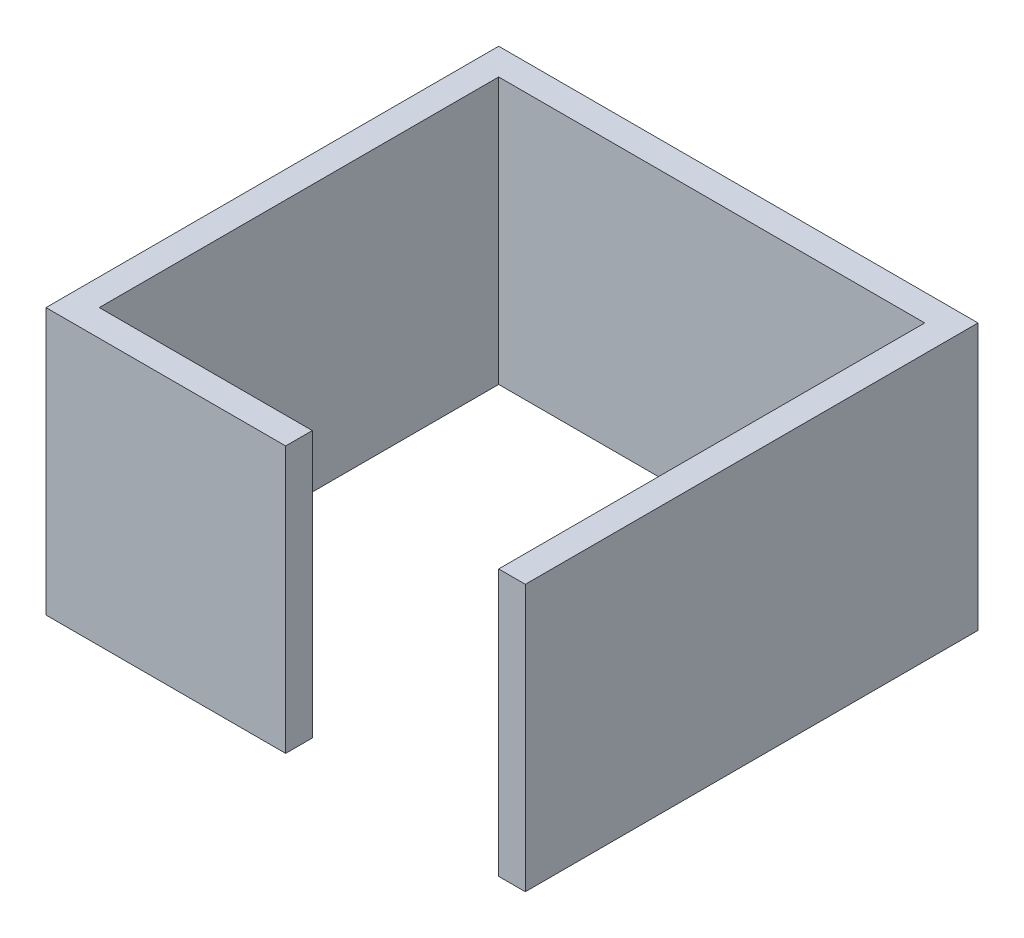
ISO-10303-21;
HEADER;
FILE_DESCRIPTION(('STEP AP214'),'2;1');
FILE_NAME('part.step','',(''),(''),'','','');
FILE_SCHEMA(('AUTOMOTIVE_DESIGN { 1 0 10303 214 1 1 1 1 }'));
ENDSEC;
DATA;
#1=APPLICATION_CONTEXT('core data for automotive mechanical design processes');
#2=APPLICATION_PROTOCOL_DEFINITION('international standard','automotive_design',2000,#1);
#3=PRODUCT_CONTEXT('',#1,'mechanical');
#4=PRODUCT('Part','Part','',(#3));
#5=PRODUCT_RELATED_PRODUCT_CATEGORY('part','',(#4));
#6=PRODUCT_DEFINITION_FORMATION('','',#4);
#7=PRODUCT_DEFINITION_CONTEXT('part definition',#1,'design');
#8=PRODUCT_DEFINITION('design','',#6,#7);
#9=PRODUCT_DEFINITION_SHAPE('','',#8);
#10=(LENGTH_UNIT() NAMED_UNIT(*) SI_UNIT(.MILLI.,.METRE.));
#11=(NAMED_UNIT(*) PLANE_ANGLE_UNIT() SI_UNIT($,.RADIAN.));
#12=(NAMED_UNIT(*) SI_UNIT($,.STERADIAN.) SOLID_ANGLE_UNIT());
#13=UNCERTAINTY_MEASURE_WITH_UNIT(LENGTH_MEASURE(1.E-05),#10,'distance_accuracy_value','');
#14=(GEOMETRIC_REPRESENTATION_CONTEXT(3) GLOBAL_UNCERTAINTY_ASSIGNED_CONTEXT((#13)) GLOBAL_UNIT_ASSIGNED_CONTEXT((#10,
#11,#12)) REPRESENTATION_CONTEXT('',''));
#15=CARTESIAN_POINT('',(0.,0.,0.));
#16=DIRECTION('',(0.,0.,1.));
#17=DIRECTION('',(1.,0.,0.));
#18=AXIS2_PLACEMENT_3D('',#15,#16,#17);
#19=CARTESIAN_POINT('',(-170.,100.,0.));
#20=DIRECTION('',(-1.,0.,0.));
#21=DIRECTION('',(0.,0.,1.));
#22=AXIS2_PLACEMENT_3D('',#19,#20,#21);
#23=PLANE('',#22);
#24=DIRECTION('',(0.,1.,0.));
#25=VECTOR('',#24,1.);
#26=CARTESIAN_POINT('',(-170.,100.,-10.));
#27=LINE('',#26,#25);
#28=CARTESIAN_POINT('',(-170.,0.,-10.));
#29=VERTEX_POINT('',#28);
#30=CARTESIAN_POINT('',(-170.,100.,-10.));
#31=VERTEX_POINT('',#30);
#32=EDGE_CURVE('E222',#29,#31,#27,.T.);
#33=ORIENTED_EDGE('',*,*,#32,.F.);
#34=DIRECTION('',(0.,0.,-1.));
#35=VECTOR('',#34,1.);
#36=CARTESIAN_POINT('',(-170.,0.,0.));
#37=LINE('',#36,#35);
#38=CARTESIAN_POINT('',(-170.,0.,-160.));
#39=VERTEX_POINT('',#38);
#40=EDGE_CURVE('E127',#29,#39,#37,.T.);
#41=ORIENTED_EDGE('',*,*,#40,.T.);
#42=DIRECTION('',(0.,-1.,0.));
#43=VECTOR('',#42,1.);
#44=CARTESIAN_POINT('',(-170.,100.,-160.));
#45=LINE('',#44,#43);
#46=CARTESIAN_POINT('',(-170.,100.,-160.));
#47=VERTEX_POINT('',#46);
#48=EDGE_CURVE('E125',#47,#39,#45,.T.);
#49=ORIENTED_EDGE('',*,*,#48,.F.);
#50=DIRECTION('',(0.,0.,-1.));
#51=VECTOR('',#50,1.);
#52=CARTESIAN_POINT('',(-170.,100.,0.));
#53=LINE('',#52,#51);
#54=EDGE_CURVE('E55',#31,#47,#53,.T.);
#55=ORIENTED_EDGE('',*,*,#54,.F.);
#56=EDGE_LOOP('',(#33,#41,#49,#55));
#57=FACE_BOUND('',#56,.T.);
#58=ADVANCED_FACE('F39',(#57),#23,.F.);
#59=CARTESIAN_POINT('',(-9.99999999999998,100.,0.));
#60=DIRECTION('',(0.,0.,-1.));
#61=DIRECTION('',(-1.,0.,0.));
#62=AXIS2_PLACEMENT_3D('',#59,#60,#61);
#63=PLANE('',#62);
#64=DIRECTION('',(1.,0.,0.));
#65=VECTOR('',#64,1.);
#66=CARTESIAN_POINT('',(-9.99999999999998,0.,0.));
#67=LINE('',#66,#65);
#68=CARTESIAN_POINT('',(-9.99999999999998,0.,0.));
#69=VERTEX_POINT('',#68);
#70=CARTESIAN_POINT('',(0.,0.,0.));
#71=VERTEX_POINT('',#70);
#72=EDGE_CURVE('E142',#69,#71,#67,.T.);
#73=ORIENTED_EDGE('',*,*,#72,.T.);
#74=DIRECTION('',(0.,-1.,0.));
#75=VECTOR('',#74,1.);
#76=CARTESIAN_POINT('',(0.,100.,0.));
#77=LINE('',#76,#75);
#78=CARTESIAN_POINT('',(0.,100.,0.));
#79=VERTEX_POINT('',#78);
#80=EDGE_CURVE('E11',#79,#71,#77,.T.);
#81=ORIENTED_EDGE('',*,*,#80,.F.);
#82=DIRECTION('',(1.,0.,0.));
#83=VECTOR('',#82,1.);
#84=CARTESIAN_POINT('',(-9.99999999999998,100.,0.));
#85=LINE('',#84,#83);
#86=CARTESIAN_POINT('',(-9.99999999999998,100.,0.));
#87=VERTEX_POINT('',#86);
#88=EDGE_CURVE('E167',#87,#79,#85,.T.);
#89=ORIENTED_EDGE('',*,*,#88,.F.);
#90=DIRECTION('',(0.,-1.,0.));
#91=VECTOR('',#90,1.);
#92=CARTESIAN_POINT('',(-9.99999999999998,100.,0.));
#93=LINE('',#92,#91);
#94=EDGE_CURVE('E138',#87,#69,#93,.T.);
#95=ORIENTED_EDGE('',*,*,#94,.T.);
#96=EDGE_LOOP('',(#73,#81,#89,#95));
#97=FACE_BOUND('',#96,.T.);
#98=ADVANCED_FACE('F41',(#97),#63,.F.);
#99=CARTESIAN_POINT('',(0.,100.,0.));
#100=DIRECTION('',(-1.,0.,0.));
#101=DIRECTION('',(0.,0.,1.));
#102=AXIS2_PLACEMENT_3D('',#99,#100,#101);
#103=PLANE('',#102);
#104=DIRECTION('',(0.,0.,-1.));
#105=VECTOR('',#104,1.);
#106=CARTESIAN_POINT('',(0.,0.,0.));
#107=LINE('',#106,#105);
#108=CARTESIAN_POINT('',(0.,0.,-170.));
#109=VERTEX_POINT('',#108);
#110=EDGE_CURVE('E146',#71,#109,#107,.T.);
#111=ORIENTED_EDGE('',*,*,#110,.T.);
#112=DIRECTION('',(0.,-1.,0.));
#113=VECTOR('',#112,1.);
#114=CARTESIAN_POINT('',(0.,100.,-170.));
#115=LINE('',#114,#113);
#116=CARTESIAN_POINT('',(0.,100.,-170.));
#117=VERTEX_POINT('',#116);
#118=EDGE_CURVE('E48',#117,#109,#115,.T.);
#119=ORIENTED_EDGE('',*,*,#118,.F.);
#120=DIRECTION('',(0.,0.,-1.));
#121=VECTOR('',#120,1.);
#122=CARTESIAN_POINT('',(0.,100.,0.));
#123=LINE('',#122,#121);
#124=EDGE_CURVE('E102',#79,#117,#123,.T.);
#125=ORIENTED_EDGE('',*,*,#124,.F.);
#126=ORIENTED_EDGE('',*,*,#80,.T.);
#127=EDGE_LOOP('',(#111,#119,#125,#126));
#128=FACE_BOUND('',#127,.T.);
#129=ADVANCED_FACE('F251',(#128),#103,.F.);
#130=CARTESIAN_POINT('',(0.,100.,-170.));
#131=DIRECTION('',(0.,0.,1.));
#132=DIRECTION('',(1.,0.,0.));
#133=AXIS2_PLACEMENT_3D('',#130,#131,#132);
#134=PLANE('',#133);
#135=DIRECTION('',(-1.,0.,0.));
#136=VECTOR('',#135,1.);
#137=CARTESIAN_POINT('',(0.,0.,-170.));
#138=LINE('',#137,#136);
#139=CARTESIAN_POINT('',(-180.,0.,-170.));
#140=VERTEX_POINT('',#139);
#141=EDGE_CURVE('E150',#109,#140,#138,.T.);
#142=ORIENTED_EDGE('',*,*,#141,.T.);
#143=DIRECTION('',(0.,-1.,0.));
#144=VECTOR('',#143,1.);
#145=CARTESIAN_POINT('',(-180.,100.,-170.));
#146=LINE('',#145,#144);
#147=CARTESIAN_POINT('',(-180.,100.,-170.));
#148=VERTEX_POINT('',#147);
#149=EDGE_CURVE('E175',#148,#140,#146,.T.);
#150=ORIENTED_EDGE('',*,*,#149,.F.);
#151=DIRECTION('',(-1.,0.,0.));
#152=VECTOR('',#151,1.);
#153=CARTESIAN_POINT('',(0.,100.,-170.));
#154=LINE('',#153,#152);
#155=EDGE_CURVE('E185',#117,#148,#154,.T.);
#156=ORIENTED_EDGE('',*,*,#155,.F.);
#157=ORIENTED_EDGE('',*,*,#118,.T.);
#158=EDGE_LOOP('',(#142,#150,#156,#157));
#159=FACE_BOUND('',#158,.T.);
#160=ADVANCED_FACE('F183',(#159),#134,.F.);
#161=CARTESIAN_POINT('',(-180.,100.,-170.));
#162=DIRECTION('',(1.,0.,0.));
#163=DIRECTION('',(0.,0.,-1.));
#164=AXIS2_PLACEMENT_3D('',#161,#162,#163);
#165=PLANE('',#164);
#166=DIRECTION('',(0.,0.,1.));
#167=VECTOR('',#166,1.);
#168=CARTESIAN_POINT('',(-180.,0.,-170.));
#169=LINE('',#168,#167);
#170=CARTESIAN_POINT('',(-180.,0.,0.));
#171=VERTEX_POINT('',#170);
#172=EDGE_CURVE('E153',#140,#171,#169,.T.);
#173=ORIENTED_EDGE('',*,*,#172,.T.);
#174=DIRECTION('',(0.,-1.,0.));
#175=VECTOR('',#174,1.);
#176=CARTESIAN_POINT('',(-180.,100.,0.));
#177=LINE('',#176,#175);
#178=CARTESIAN_POINT('',(-180.,100.,0.));
#179=VERTEX_POINT('',#178);
#180=EDGE_CURVE('E131',#179,#171,#177,.T.);
#181=ORIENTED_EDGE('',*,*,#180,.F.);
#182=DIRECTION('',(0.,0.,1.));
#183=VECTOR('',#182,1.);
#184=CARTESIAN_POINT('',(-180.,100.,-170.));
#185=LINE('',#184,#183);
#186=EDGE_CURVE('E206',#148,#179,#185,.T.);
#187=ORIENTED_EDGE('',*,*,#186,.F.);
#188=ORIENTED_EDGE('',*,*,#149,.T.);
#189=EDGE_LOOP('',(#173,#181,#187,#188));
#190=FACE_BOUND('',#189,.T.);
#191=ADVANCED_FACE('F194',(#190),#165,.F.);
#192=CARTESIAN_POINT('',(-180.,100.,0.));
#193=DIRECTION('',(0.,0.,-1.));
#194=DIRECTION('',(-1.,0.,0.));
#195=AXIS2_PLACEMENT_3D('',#192,#193,#194);
#196=PLANE('',#195);
#197=DIRECTION('',(1.,0.,0.));
#198=VECTOR('',#197,1.);
#199=CARTESIAN_POINT('',(-180.,0.,0.));
#200=LINE('',#199,#198);
#201=CARTESIAN_POINT('',(-90.,0.,0.));
#202=VERTEX_POINT('',#201);
#203=EDGE_CURVE('E156',#171,#202,#200,.T.);
#204=ORIENTED_EDGE('',*,*,#203,.T.);
#205=DIRECTION('',(0.,-1.,0.));
#206=VECTOR('',#205,1.);
#207=CARTESIAN_POINT('',(-90.,100.,0.));
#208=LINE('',#207,#206);
#209=CARTESIAN_POINT('',(-90.,100.,0.));
#210=VERTEX_POINT('',#209);
#211=EDGE_CURVE('E203',#210,#202,#208,.T.);
#212=ORIENTED_EDGE('',*,*,#211,.F.);
#213=DIRECTION('',(1.,0.,0.));
#214=VECTOR('',#213,1.);
#215=CARTESIAN_POINT('',(-180.,100.,0.));
#216=LINE('',#215,#214);
#217=EDGE_CURVE('E122',#179,#210,#216,.T.);
#218=ORIENTED_EDGE('',*,*,#217,.F.);
#219=ORIENTED_EDGE('',*,*,#180,.T.);
#220=EDGE_LOOP('',(#204,#212,#218,#219));
#221=FACE_BOUND('',#220,.T.);
#222=ADVANCED_FACE('F198',(#221),#196,.F.);
#223=CARTESIAN_POINT('',(-170.,100.,-160.));
#224=DIRECTION('',(0.,0.,-1.));
#225=DIRECTION('',(-1.,0.,0.));
#226=AXIS2_PLACEMENT_3D('',#223,#224,#225);
#227=PLANE('',#226);
#228=DIRECTION('',(1.,0.,0.));
#229=VECTOR('',#228,1.);
#230=CARTESIAN_POINT('',(-170.,0.,-160.));
#231=LINE('',#230,#229);
#232=CARTESIAN_POINT('',(-10.,0.,-160.));
#233=VERTEX_POINT('',#232);
#234=EDGE_CURVE('E162',#39,#233,#231,.T.);
#235=ORIENTED_EDGE('',*,*,#234,.T.);
#236=DIRECTION('',(0.,-1.,0.));
#237=VECTOR('',#236,1.);
#238=CARTESIAN_POINT('',(-10.,100.,-160.));
#239=LINE('',#238,#237);
#240=CARTESIAN_POINT('',(-10.,100.,-160.));
#241=VERTEX_POINT('',#240);
#242=EDGE_CURVE('E132',#241,#233,#239,.T.);
#243=ORIENTED_EDGE('',*,*,#242,.F.);
#244=DIRECTION('',(1.,0.,0.));
#245=VECTOR('',#244,1.);
#246=CARTESIAN_POINT('',(-170.,100.,-160.));
#247=LINE('',#246,#245);
#248=EDGE_CURVE('E116',#47,#241,#247,.T.);
#249=ORIENTED_EDGE('',*,*,#248,.F.);
#250=ORIENTED_EDGE('',*,*,#48,.T.);
#251=EDGE_LOOP('',(#235,#243,#249,#250));
#252=FACE_BOUND('',#251,.T.);
#253=ADVANCED_FACE('F134',(#252),#227,.F.);
#254=CARTESIAN_POINT('',(-10.,100.,-160.));
#255=DIRECTION('',(1.,0.,0.));
#256=DIRECTION('',(0.,0.,-1.));
#257=AXIS2_PLACEMENT_3D('',#254,#255,#256);
#258=PLANE('',#257);
#259=DIRECTION('',(0.,0.,1.));
#260=VECTOR('',#259,1.);
#261=CARTESIAN_POINT('',(-10.,0.,-160.));
#262=LINE('',#261,#260);
#263=EDGE_CURVE('E94',#233,#69,#262,.T.);
#264=ORIENTED_EDGE('',*,*,#263,.T.);
#265=ORIENTED_EDGE('',*,*,#94,.F.);
#266=DIRECTION('',(0.,0.,1.));
#267=VECTOR('',#266,1.);
#268=CARTESIAN_POINT('',(-10.,100.,-160.));
#269=LINE('',#268,#267);
#270=EDGE_CURVE('E64',#241,#87,#269,.T.);
#271=ORIENTED_EDGE('',*,*,#270,.F.);
#272=ORIENTED_EDGE('',*,*,#242,.T.);
#273=EDGE_LOOP('',(#264,#265,#271,#272));
#274=FACE_BOUND('',#273,.T.);
#275=ADVANCED_FACE('F247',(#274),#258,.F.);
#276=CARTESIAN_POINT('',(0.,100.,0.));
#277=DIRECTION('',(0.,1.,0.));
#278=DIRECTION('',(0.,0.,1.));
#279=AXIS2_PLACEMENT_3D('',#276,#277,#278);
#280=PLANE('',#279);
#281=ORIENTED_EDGE('',*,*,#88,.T.);
#282=ORIENTED_EDGE('',*,*,#124,.T.);
#283=ORIENTED_EDGE('',*,*,#155,.T.);
#284=ORIENTED_EDGE('',*,*,#186,.T.);
#285=ORIENTED_EDGE('',*,*,#217,.T.);
#286=DIRECTION('',(0.,0.,1.));
#287=VECTOR('',#286,1.);
#288=CARTESIAN_POINT('',(-90.,100.,0.));
#289=LINE('',#288,#287);
#290=CARTESIAN_POINT('',(-90.,100.,-10.));
#291=VERTEX_POINT('',#290);
#292=EDGE_CURVE('E221',#291,#210,#289,.T.);
#293=ORIENTED_EDGE('',*,*,#292,.F.);
#294=DIRECTION('',(-1.,0.,0.));
#295=VECTOR('',#294,1.);
#296=CARTESIAN_POINT('',(-90.,100.,-10.));
#297=LINE('',#296,#295);
#298=EDGE_CURVE('E120',#291,#31,#297,.T.);
#299=ORIENTED_EDGE('',*,*,#298,.T.);
#300=ORIENTED_EDGE('',*,*,#54,.T.);
#301=ORIENTED_EDGE('',*,*,#248,.T.);
#302=ORIENTED_EDGE('',*,*,#270,.T.);
#303=EDGE_LOOP('',(#281,#282,#283,#284,#285,#293,#299,#300,#301,#302));
#304=FACE_BOUND('',#303,.T.);
#305=ADVANCED_FACE('F114',(#304),#280,.T.);
#306=CARTESIAN_POINT('',(0.,0.,0.));
#307=DIRECTION('',(0.,1.,0.));
#308=DIRECTION('',(0.,0.,1.));
#309=AXIS2_PLACEMENT_3D('',#306,#307,#308);
#310=PLANE('',#309);
#311=ORIENTED_EDGE('',*,*,#72,.F.);
#312=ORIENTED_EDGE('',*,*,#263,.F.);
#313=ORIENTED_EDGE('',*,*,#234,.F.);
#314=ORIENTED_EDGE('',*,*,#40,.F.);
#315=DIRECTION('',(-1.,0.,0.));
#316=VECTOR('',#315,1.);
#317=CARTESIAN_POINT('',(-90.,0.,-10.));
#318=LINE('',#317,#316);
#319=CARTESIAN_POINT('',(-90.,0.,-10.));
#320=VERTEX_POINT('',#319);
#321=EDGE_CURVE('E147',#320,#29,#318,.T.);
#322=ORIENTED_EDGE('',*,*,#321,.F.);
#323=DIRECTION('',(0.,0.,-1.));
#324=VECTOR('',#323,1.);
#325=CARTESIAN_POINT('',(-90.,0.,0.));
#326=LINE('',#325,#324);
#327=EDGE_CURVE('E231',#202,#320,#326,.T.);
#328=ORIENTED_EDGE('',*,*,#327,.F.);
#329=ORIENTED_EDGE('',*,*,#203,.F.);
#330=ORIENTED_EDGE('',*,*,#172,.F.);
#331=ORIENTED_EDGE('',*,*,#141,.F.);
#332=ORIENTED_EDGE('',*,*,#110,.F.);
#333=EDGE_LOOP('',(#311,#312,#313,#314,#322,#328,#329,#330,#331,#332));
#334=FACE_BOUND('',#333,.T.);
#335=ADVANCED_FACE('F189',(#334),#310,.F.);
#336=CARTESIAN_POINT('',(-90.,100.,-10.));
#337=DIRECTION('',(0.,0.,1.));
#338=DIRECTION('',(0.,-1.,0.));
#339=AXIS2_PLACEMENT_3D('',#336,#337,#338);
#340=PLANE('',#339);
#341=ORIENTED_EDGE('',*,*,#32,.T.);
#342=ORIENTED_EDGE('',*,*,#298,.F.);
#343=DIRECTION('',(0.,1.,0.));
#344=VECTOR('',#343,1.);
#345=CARTESIAN_POINT('',(-90.,100.,-10.));
#346=LINE('',#345,#344);
#347=EDGE_CURVE('E227',#320,#291,#346,.T.);
#348=ORIENTED_EDGE('',*,*,#347,.F.);
#349=ORIENTED_EDGE('',*,*,#321,.T.);
#350=EDGE_LOOP('',(#341,#342,#348,#349));
#351=FACE_BOUND('',#350,.T.);
#352=ADVANCED_FACE('F246',(#351),#340,.F.);
#353=CARTESIAN_POINT('',(-90.,0.,0.));
#354=DIRECTION('',(1.,0.,0.));
#355=DIRECTION('',(0.,0.,-1.));
#356=AXIS2_PLACEMENT_3D('',#353,#354,#355);
#357=PLANE('',#356);
#358=ORIENTED_EDGE('',*,*,#211,.T.);
#359=ORIENTED_EDGE('',*,*,#327,.T.);
#360=ORIENTED_EDGE('',*,*,#347,.T.);
#361=ORIENTED_EDGE('',*,*,#292,.T.);
#362=EDGE_LOOP('',(#358,#359,#360,#361));
#363=FACE_BOUND('',#362,.T.);
#364=ADVANCED_FACE('F237',(#363),#357,.T.);
#365=CLOSED_SHELL('',(#58,#98,#129,#160,#191,#222,#253,#275,#305,#335,#352,#364));
#366=MANIFOLD_SOLID_BREP('B2',#365);
#367=ADVANCED_BREP_SHAPE_REPRESENTATION('',(#18,#366),#14);
#368=SHAPE_DEFINITION_REPRESENTATION(#9,#367);
ENDSEC;
END-ISO-10303-21;
